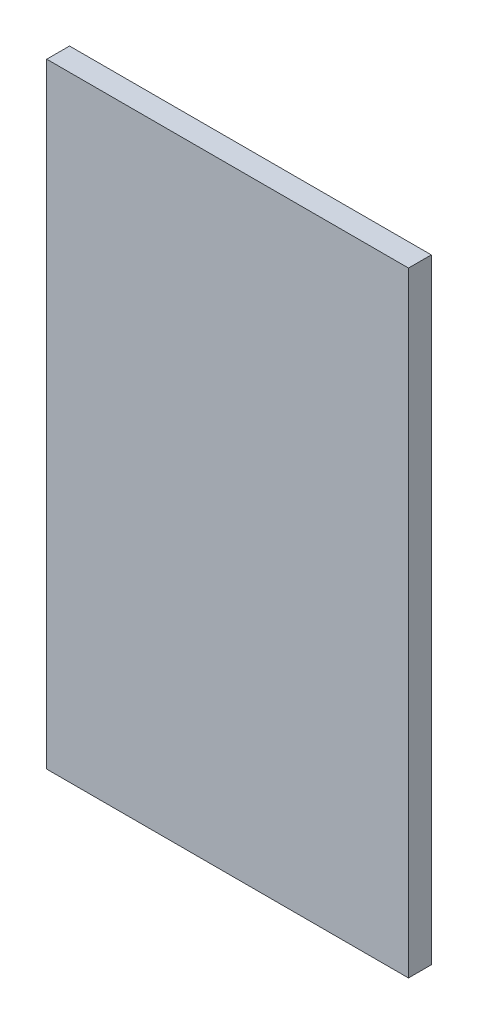
ISO-10303-21;
HEADER;
FILE_DESCRIPTION(('STEP AP214'),'2;1');
FILE_NAME('part.step','',(''),(''),'','','');
FILE_SCHEMA(('AUTOMOTIVE_DESIGN { 1 0 10303 214 1 1 1 1 }'));
ENDSEC;
DATA;
#1=APPLICATION_CONTEXT('core data for automotive mechanical design processes');
#2=APPLICATION_PROTOCOL_DEFINITION('international standard','automotive_design',2000,#1);
#3=PRODUCT_CONTEXT('',#1,'mechanical');
#4=PRODUCT('Part','Part','',(#3));
#5=PRODUCT_RELATED_PRODUCT_CATEGORY('part','',(#4));
#6=PRODUCT_DEFINITION_FORMATION('','',#4);
#7=PRODUCT_DEFINITION_CONTEXT('part definition',#1,'design');
#8=PRODUCT_DEFINITION('design','',#6,#7);
#9=PRODUCT_DEFINITION_SHAPE('','',#8);
#10=(LENGTH_UNIT() NAMED_UNIT(*) SI_UNIT(.MILLI.,.METRE.));
#11=(NAMED_UNIT(*) PLANE_ANGLE_UNIT() SI_UNIT($,.RADIAN.));
#12=(NAMED_UNIT(*) SI_UNIT($,.STERADIAN.) SOLID_ANGLE_UNIT());
#13=UNCERTAINTY_MEASURE_WITH_UNIT(LENGTH_MEASURE(1.E-05),#10,'distance_accuracy_value','');
#14=(GEOMETRIC_REPRESENTATION_CONTEXT(3) GLOBAL_UNCERTAINTY_ASSIGNED_CONTEXT((#13)) GLOBAL_UNIT_ASSIGNED_CONTEXT((#10,
#11,#12)) REPRESENTATION_CONTEXT('',''));
#15=CARTESIAN_POINT('',(0.,0.,0.));
#16=DIRECTION('',(0.,0.,1.));
#17=DIRECTION('',(1.,0.,0.));
#18=AXIS2_PLACEMENT_3D('',#15,#16,#17);
#19=CARTESIAN_POINT('',(97.8104028868791,120.223374760495,180.59));
#20=DIRECTION('',(3.91342339355777E-06,0.999999999992343,0.));
#21=DIRECTION('',(-0.999999999992343,3.91342339355777E-06,0.));
#22=AXIS2_PLACEMENT_3D('',#19,#20,#21);
#23=PLANE('',#22);
#24=DIRECTION('',(-0.999999999992343,3.91342340332E-06,0.));
#25=VECTOR('',#24,1.);
#26=CARTESIAN_POINT('',(97.8004028868791,120.223374799629,183.6));
#27=LINE('',#26,#25);
#28=CARTESIAN_POINT('',(97.8004028868791,120.223374799629,183.6));
#29=VERTEX_POINT('',#28);
#30=CARTESIAN_POINT('',(50.2004028872437,120.223561078583,183.6));
#31=VERTEX_POINT('',#30);
#32=EDGE_CURVE('E71',#29,#31,#27,.T.);
#33=ORIENTED_EDGE('',*,*,#32,.F.);
#34=DIRECTION('',(0.,0.,1.));
#35=VECTOR('',#34,1.);
#36=CARTESIAN_POINT('',(97.8004028868792,120.223374799629,182.1));
#37=LINE('',#36,#35);
#38=CARTESIAN_POINT('',(97.8004028868792,120.223374799629,180.6));
#39=VERTEX_POINT('',#38);
#40=EDGE_CURVE('E61',#39,#29,#37,.T.);
#41=ORIENTED_EDGE('',*,*,#40,.F.);
#42=DIRECTION('',(0.999999999992343,-3.91342340361155E-06,0.));
#43=VECTOR('',#42,1.);
#44=CARTESIAN_POINT('',(50.2004028872437,120.223561078583,180.6));
#45=LINE('',#44,#43);
#46=CARTESIAN_POINT('',(50.2004028872437,120.223561078583,180.6));
#47=VERTEX_POINT('',#46);
#48=EDGE_CURVE('E21',#47,#39,#45,.T.);
#49=ORIENTED_EDGE('',*,*,#48,.F.);
#50=DIRECTION('',(0.,0.,-1.));
#51=VECTOR('',#50,1.);
#52=CARTESIAN_POINT('',(50.2004028872437,120.223561078583,182.1));
#53=LINE('',#52,#51);
#54=EDGE_CURVE('E60',#31,#47,#53,.T.);
#55=ORIENTED_EDGE('',*,*,#54,.F.);
#56=EDGE_LOOP('',(#33,#41,#49,#55));
#57=FACE_BOUND('',#56,.T.);
#58=ADVANCED_FACE('F17',(#57),#23,.T.);
#59=CARTESIAN_POINT('',(97.8104028868791,39.3133748002484,180.6));
#60=DIRECTION('',(0.,0.,-1.));
#61=DIRECTION('',(-1.,0.,0.));
#62=AXIS2_PLACEMENT_3D('',#59,#60,#61);
#63=PLANE('',#62);
#64=DIRECTION('',(-3.91342339980422E-06,-0.999999999992343,0.));
#65=VECTOR('',#64,1.);
#66=CARTESIAN_POINT('',(50.2002445892672,79.7735610788926,180.6));
#67=LINE('',#66,#65);
#68=CARTESIAN_POINT('',(50.2000862937906,39.3235610792022,180.6));
#69=VERTEX_POINT('',#68);
#70=EDGE_CURVE('E66',#47,#69,#67,.T.);
#71=ORIENTED_EDGE('',*,*,#70,.F.);
#72=ORIENTED_EDGE('',*,*,#48,.T.);
#73=DIRECTION('',(3.91342339963273E-06,0.999999999992343,0.));
#74=VECTOR('',#73,1.);
#75=CARTESIAN_POINT('',(97.8002445889026,79.7733747999387,180.6));
#76=LINE('',#75,#74);
#77=CARTESIAN_POINT('',(97.8000862909261,39.3233748027485,180.6));
#78=VERTEX_POINT('',#77);
#79=EDGE_CURVE('E64',#78,#39,#76,.T.);
#80=ORIENTED_EDGE('',*,*,#79,.F.);
#81=DIRECTION('',(0.999999999992343,-3.91342339967775E-06,0.));
#82=VECTOR('',#81,1.);
#83=CARTESIAN_POINT('',(74.0000862911084,39.3234679397253,180.6));
#84=LINE('',#83,#82);
#85=EDGE_CURVE('E69',#69,#78,#84,.T.);
#86=ORIENTED_EDGE('',*,*,#85,.F.);
#87=EDGE_LOOP('',(#71,#72,#80,#86));
#88=FACE_BOUND('',#87,.T.);
#89=ADVANCED_FACE('F67',(#88),#63,.T.);
#90=CARTESIAN_POINT('',(97.8000862517919,39.3133748002485,180.59));
#91=DIRECTION('',(0.999999999992343,-3.91342339963273E-06,0.));
#92=DIRECTION('',(3.91342339963273E-06,0.999999999992343,0.));
#93=AXIS2_PLACEMENT_3D('',#90,#91,#92);
#94=PLANE('',#93);
#95=DIRECTION('',(3.91342339920261E-06,0.999999999992343,0.));
#96=VECTOR('',#95,1.);
#97=CARTESIAN_POINT('',(97.8000862909261,39.3233748002485,183.6));
#98=LINE('',#97,#96);
#99=CARTESIAN_POINT('',(97.8000862909261,39.3233748002484,183.6));
#100=VERTEX_POINT('',#99);
#101=EDGE_CURVE('E80',#100,#29,#98,.T.);
#102=ORIENTED_EDGE('',*,*,#101,.F.);
#103=DIRECTION('',(0.,0.,1.));
#104=VECTOR('',#103,1.);
#105=CARTESIAN_POINT('',(97.8000862909261,39.3233748002484,182.1));
#106=LINE('',#105,#104);
#107=EDGE_CURVE('E75',#78,#100,#106,.T.);
#108=ORIENTED_EDGE('',*,*,#107,.F.);
#109=ORIENTED_EDGE('',*,*,#79,.T.);
#110=ORIENTED_EDGE('',*,*,#40,.T.);
#111=EDGE_LOOP('',(#102,#108,#109,#110));
#112=FACE_BOUND('',#111,.T.);
#113=ADVANCED_FACE('F90',(#112),#94,.T.);
#114=CARTESIAN_POINT('',(50.1900862912906,39.3133748002484,183.6));
#115=DIRECTION('',(0.,0.,1.));
#116=DIRECTION('',(1.,0.,0.));
#117=AXIS2_PLACEMENT_3D('',#114,#115,#116);
#118=PLANE('',#117);
#119=DIRECTION('',(3.91342339980422E-06,0.999999999992343,0.));
#120=VECTOR('',#119,1.);
#121=CARTESIAN_POINT('',(50.2002445892672,79.7735610788926,183.6));
#122=LINE('',#121,#120);
#123=CARTESIAN_POINT('',(50.2000862912906,39.3235610817022,183.6));
#124=VERTEX_POINT('',#123);
#125=EDGE_CURVE('E36',#124,#31,#122,.T.);
#126=ORIENTED_EDGE('',*,*,#125,.F.);
#127=DIRECTION('',(-0.999999999992343,3.91342339982346E-06,0.));
#128=VECTOR('',#127,1.);
#129=CARTESIAN_POINT('',(74.0000862911084,39.3234679397253,183.6));
#130=LINE('',#129,#128);
#131=EDGE_CURVE('E27',#100,#124,#130,.T.);
#132=ORIENTED_EDGE('',*,*,#131,.F.);
#133=ORIENTED_EDGE('',*,*,#101,.T.);
#134=ORIENTED_EDGE('',*,*,#32,.T.);
#135=EDGE_LOOP('',(#126,#132,#133,#134));
#136=FACE_BOUND('',#135,.T.);
#137=ADVANCED_FACE('F87',(#136),#118,.T.);
#138=CARTESIAN_POINT('',(50.2004029263779,120.233561078583,180.59));
#139=DIRECTION('',(-0.999999999992343,3.91342339980422E-06,0.));
#140=DIRECTION('',(-3.91342339980422E-06,-0.999999999992343,0.));
#141=AXIS2_PLACEMENT_3D('',#138,#139,#140);
#142=PLANE('',#141);
#143=ORIENTED_EDGE('',*,*,#125,.T.);
#144=ORIENTED_EDGE('',*,*,#54,.T.);
#145=ORIENTED_EDGE('',*,*,#70,.T.);
#146=DIRECTION('',(0.,0.,-1.));
#147=VECTOR('',#146,1.);
#148=CARTESIAN_POINT('',(50.2000862912907,39.3235610792023,182.1));
#149=LINE('',#148,#147);
#150=EDGE_CURVE('E11',#124,#69,#149,.T.);
#151=ORIENTED_EDGE('',*,*,#150,.F.);
#152=EDGE_LOOP('',(#143,#144,#145,#151));
#153=FACE_BOUND('',#152,.T.);
#154=ADVANCED_FACE('F73',(#153),#142,.T.);
#155=CARTESIAN_POINT('',(50.1900862912907,39.3235611183365,180.59));
#156=DIRECTION('',(-3.91342339982346E-06,-0.999999999992343,0.));
#157=DIRECTION('',(0.999999999992343,-3.91342339982346E-06,0.));
#158=AXIS2_PLACEMENT_3D('',#155,#156,#157);
#159=PLANE('',#158);
#160=ORIENTED_EDGE('',*,*,#131,.T.);
#161=ORIENTED_EDGE('',*,*,#150,.T.);
#162=ORIENTED_EDGE('',*,*,#85,.T.);
#163=ORIENTED_EDGE('',*,*,#107,.T.);
#164=EDGE_LOOP('',(#160,#161,#162,#163));
#165=FACE_BOUND('',#164,.T.);
#166=ADVANCED_FACE('F19',(#165),#159,.T.);
#167=CLOSED_SHELL('',(#58,#89,#113,#137,#154,#166));
#168=MANIFOLD_SOLID_BREP('B1',#167);
#169=ADVANCED_BREP_SHAPE_REPRESENTATION('',(#18,#168),#14);
#170=SHAPE_DEFINITION_REPRESENTATION(#9,#169);
ENDSEC;
END-ISO-10303-21;
